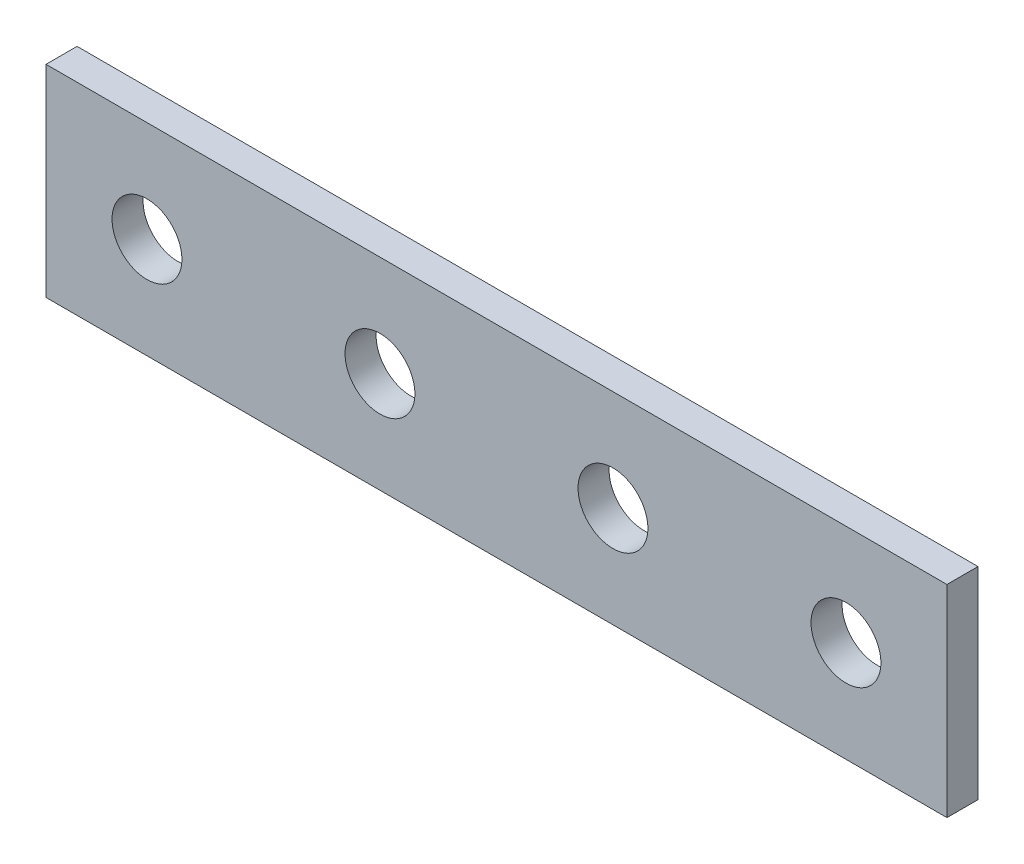
ISO-10303-21;
HEADER;
FILE_DESCRIPTION(('STEP AP214'),'2;1');
FILE_NAME('part.step','',(''),(''),'','','');
FILE_SCHEMA(('AUTOMOTIVE_DESIGN { 1 0 10303 214 1 1 1 1 }'));
ENDSEC;
DATA;
#1=APPLICATION_CONTEXT('core data for automotive mechanical design processes');
#2=APPLICATION_PROTOCOL_DEFINITION('international standard','automotive_design',2000,#1);
#3=PRODUCT_CONTEXT('',#1,'mechanical');
#4=PRODUCT('Part','Part','',(#3));
#5=PRODUCT_RELATED_PRODUCT_CATEGORY('part','',(#4));
#6=PRODUCT_DEFINITION_FORMATION('','',#4);
#7=PRODUCT_DEFINITION_CONTEXT('part definition',#1,'design');
#8=PRODUCT_DEFINITION('design','',#6,#7);
#9=PRODUCT_DEFINITION_SHAPE('','',#8);
#10=(LENGTH_UNIT() NAMED_UNIT(*) SI_UNIT(.MILLI.,.METRE.));
#11=(NAMED_UNIT(*) PLANE_ANGLE_UNIT() SI_UNIT($,.RADIAN.));
#12=(NAMED_UNIT(*) SI_UNIT($,.STERADIAN.) SOLID_ANGLE_UNIT());
#13=UNCERTAINTY_MEASURE_WITH_UNIT(LENGTH_MEASURE(1.E-05),#10,'distance_accuracy_value','');
#14=(GEOMETRIC_REPRESENTATION_CONTEXT(3) GLOBAL_UNCERTAINTY_ASSIGNED_CONTEXT((#13)) GLOBAL_UNIT_ASSIGNED_CONTEXT((#10,
#11,#12)) REPRESENTATION_CONTEXT('',''));
#15=CARTESIAN_POINT('',(0.,0.,0.));
#16=DIRECTION('',(0.,0.,1.));
#17=DIRECTION('',(1.,0.,0.));
#18=AXIS2_PLACEMENT_3D('',#15,#16,#17);
#19=CARTESIAN_POINT('',(-92.075,-20.6375,3.175));
#20=DIRECTION('',(0.,0.,1.));
#21=DIRECTION('',(1.,0.,0.));
#22=AXIS2_PLACEMENT_3D('',#19,#20,#21);
#23=PLANE('',#22);
#24=CARTESIAN_POINT('',(23.8125,0.,3.175));
#25=DIRECTION('',(0.,0.,1.));
#26=DIRECTION('',(1.,0.,0.));
#27=AXIS2_PLACEMENT_3D('',#24,#25,#26);
#28=CIRCLE('',#27,7.14375);
#29=CARTESIAN_POINT('',(30.95625,0.,3.175));
#30=VERTEX_POINT('',#29);
#31=EDGE_CURVE('E144',#30,#30,#28,.T.);
#32=ORIENTED_EDGE('',*,*,#31,.F.);
#33=EDGE_LOOP('',(#32));
#34=FACE_BOUND('',#33,.T.);
#35=CARTESIAN_POINT('',(-71.4375,0.,3.175));
#36=DIRECTION('',(0.,0.,1.));
#37=DIRECTION('',(1.,0.,0.));
#38=AXIS2_PLACEMENT_3D('',#35,#36,#37);
#39=CIRCLE('',#38,7.14375);
#40=CARTESIAN_POINT('',(-64.29375,0.,3.175));
#41=VERTEX_POINT('',#40);
#42=EDGE_CURVE('E114',#41,#41,#39,.T.);
#43=ORIENTED_EDGE('',*,*,#42,.F.);
#44=EDGE_LOOP('',(#43));
#45=FACE_BOUND('',#44,.T.);
#46=DIRECTION('',(0.,-1.,0.));
#47=VECTOR('',#46,1.);
#48=CARTESIAN_POINT('',(-92.075,20.6375,3.175));
#49=LINE('',#48,#47);
#50=CARTESIAN_POINT('',(-92.075,20.6375,3.175));
#51=VERTEX_POINT('',#50);
#52=CARTESIAN_POINT('',(-92.075,-20.6375,3.175));
#53=VERTEX_POINT('',#52);
#54=EDGE_CURVE('E94',#51,#53,#49,.T.);
#55=ORIENTED_EDGE('',*,*,#54,.T.);
#56=DIRECTION('',(1.,0.,0.));
#57=VECTOR('',#56,1.);
#58=CARTESIAN_POINT('',(-92.075,-20.6375,3.175));
#59=LINE('',#58,#57);
#60=CARTESIAN_POINT('',(92.075,-20.6375,3.175));
#61=VERTEX_POINT('',#60);
#62=EDGE_CURVE('E89',#53,#61,#59,.T.);
#63=ORIENTED_EDGE('',*,*,#62,.T.);
#64=DIRECTION('',(0.,1.,0.));
#65=VECTOR('',#64,1.);
#66=CARTESIAN_POINT('',(92.075,20.6375,3.175));
#67=LINE('',#66,#65);
#68=CARTESIAN_POINT('',(92.075,20.6375,3.175));
#69=VERTEX_POINT('',#68);
#70=EDGE_CURVE('E92',#61,#69,#67,.T.);
#71=ORIENTED_EDGE('',*,*,#70,.T.);
#72=DIRECTION('',(-1.,0.,0.));
#73=VECTOR('',#72,1.);
#74=CARTESIAN_POINT('',(-92.075,20.6375,3.175));
#75=LINE('',#74,#73);
#76=EDGE_CURVE('E59',#69,#51,#75,.T.);
#77=ORIENTED_EDGE('',*,*,#76,.T.);
#78=EDGE_LOOP('',(#55,#63,#71,#77));
#79=FACE_BOUND('',#78,.T.);
#80=CARTESIAN_POINT('',(-23.8125,0.,3.175));
#81=DIRECTION('',(0.,0.,1.));
#82=DIRECTION('',(1.,0.,0.));
#83=AXIS2_PLACEMENT_3D('',#80,#81,#82);
#84=CIRCLE('',#83,7.14375);
#85=CARTESIAN_POINT('',(-16.66875,0.,3.175));
#86=VERTEX_POINT('',#85);
#87=EDGE_CURVE('E136',#86,#86,#84,.T.);
#88=ORIENTED_EDGE('',*,*,#87,.F.);
#89=EDGE_LOOP('',(#88));
#90=FACE_BOUND('',#89,.T.);
#91=CARTESIAN_POINT('',(71.4375,0.,3.175));
#92=DIRECTION('',(0.,0.,1.));
#93=DIRECTION('',(1.,0.,0.));
#94=AXIS2_PLACEMENT_3D('',#91,#92,#93);
#95=CIRCLE('',#94,7.14374999999999);
#96=CARTESIAN_POINT('',(78.58125,0.,3.175));
#97=VERTEX_POINT('',#96);
#98=EDGE_CURVE('E152',#97,#97,#95,.T.);
#99=ORIENTED_EDGE('',*,*,#98,.F.);
#100=EDGE_LOOP('',(#99));
#101=FACE_BOUND('',#100,.T.);
#102=ADVANCED_FACE('F41',(#34,#45,#79,#90,#101),#23,.T.);
#103=CARTESIAN_POINT('',(-92.075,-20.6375,-3.175));
#104=DIRECTION('',(0.,0.,1.));
#105=DIRECTION('',(1.,0.,0.));
#106=AXIS2_PLACEMENT_3D('',#103,#104,#105);
#107=PLANE('',#106);
#108=DIRECTION('',(0.,-1.,0.));
#109=VECTOR('',#108,1.);
#110=CARTESIAN_POINT('',(-92.075,20.6375,-3.175));
#111=LINE('',#110,#109);
#112=CARTESIAN_POINT('',(-92.075,20.6375,-3.175));
#113=VERTEX_POINT('',#112);
#114=CARTESIAN_POINT('',(-92.075,-20.6375,-3.175));
#115=VERTEX_POINT('',#114);
#116=EDGE_CURVE('E110',#113,#115,#111,.T.);
#117=ORIENTED_EDGE('',*,*,#116,.F.);
#118=DIRECTION('',(-1.,0.,0.));
#119=VECTOR('',#118,1.);
#120=CARTESIAN_POINT('',(-92.075,20.6375,-3.175));
#121=LINE('',#120,#119);
#122=CARTESIAN_POINT('',(92.075,20.6375,-3.175));
#123=VERTEX_POINT('',#122);
#124=EDGE_CURVE('E82',#123,#113,#121,.T.);
#125=ORIENTED_EDGE('',*,*,#124,.F.);
#126=DIRECTION('',(0.,1.,0.));
#127=VECTOR('',#126,1.);
#128=CARTESIAN_POINT('',(92.075,20.6375,-3.175));
#129=LINE('',#128,#127);
#130=CARTESIAN_POINT('',(92.075,-20.6375,-3.175));
#131=VERTEX_POINT('',#130);
#132=EDGE_CURVE('E76',#131,#123,#129,.T.);
#133=ORIENTED_EDGE('',*,*,#132,.F.);
#134=DIRECTION('',(1.,0.,0.));
#135=VECTOR('',#134,1.);
#136=CARTESIAN_POINT('',(-92.075,-20.6375,-3.175));
#137=LINE('',#136,#135);
#138=EDGE_CURVE('E99',#115,#131,#137,.T.);
#139=ORIENTED_EDGE('',*,*,#138,.F.);
#140=EDGE_LOOP('',(#117,#125,#133,#139));
#141=FACE_BOUND('',#140,.T.);
#142=CARTESIAN_POINT('',(-71.4375,0.,-3.175));
#143=DIRECTION('',(0.,0.,1.));
#144=DIRECTION('',(1.,0.,0.));
#145=AXIS2_PLACEMENT_3D('',#142,#143,#144);
#146=CIRCLE('',#145,7.14375);
#147=CARTESIAN_POINT('',(-64.29375,0.,-3.175));
#148=VERTEX_POINT('',#147);
#149=EDGE_CURVE('E132',#148,#148,#146,.T.);
#150=ORIENTED_EDGE('',*,*,#149,.T.);
#151=EDGE_LOOP('',(#150));
#152=FACE_BOUND('',#151,.T.);
#153=CARTESIAN_POINT('',(-23.8125,0.,-3.175));
#154=DIRECTION('',(0.,0.,1.));
#155=DIRECTION('',(1.,0.,0.));
#156=AXIS2_PLACEMENT_3D('',#153,#154,#155);
#157=CIRCLE('',#156,7.14375);
#158=CARTESIAN_POINT('',(-16.66875,0.,-3.175));
#159=VERTEX_POINT('',#158);
#160=EDGE_CURVE('E140',#159,#159,#157,.T.);
#161=ORIENTED_EDGE('',*,*,#160,.T.);
#162=EDGE_LOOP('',(#161));
#163=FACE_BOUND('',#162,.T.);
#164=CARTESIAN_POINT('',(23.8125,0.,-3.175));
#165=DIRECTION('',(0.,0.,1.));
#166=DIRECTION('',(1.,0.,0.));
#167=AXIS2_PLACEMENT_3D('',#164,#165,#166);
#168=CIRCLE('',#167,7.14375);
#169=CARTESIAN_POINT('',(30.95625,0.,-3.175));
#170=VERTEX_POINT('',#169);
#171=EDGE_CURVE('E148',#170,#170,#168,.T.);
#172=ORIENTED_EDGE('',*,*,#171,.T.);
#173=EDGE_LOOP('',(#172));
#174=FACE_BOUND('',#173,.T.);
#175=CARTESIAN_POINT('',(71.4375,0.,-3.175));
#176=DIRECTION('',(0.,0.,1.));
#177=DIRECTION('',(1.,0.,0.));
#178=AXIS2_PLACEMENT_3D('',#175,#176,#177);
#179=CIRCLE('',#178,7.14374999999999);
#180=CARTESIAN_POINT('',(78.58125,0.,-3.175));
#181=VERTEX_POINT('',#180);
#182=EDGE_CURVE('E156',#181,#181,#179,.T.);
#183=ORIENTED_EDGE('',*,*,#182,.T.);
#184=EDGE_LOOP('',(#183));
#185=FACE_BOUND('',#184,.T.);
#186=ADVANCED_FACE('F127',(#141,#152,#163,#174,#185),#107,.F.);
#187=CARTESIAN_POINT('',(-92.075,20.6375,3.175));
#188=DIRECTION('',(1.,0.,0.));
#189=DIRECTION('',(0.,0.,-1.));
#190=AXIS2_PLACEMENT_3D('',#187,#188,#189);
#191=PLANE('',#190);
#192=ORIENTED_EDGE('',*,*,#116,.T.);
#193=DIRECTION('',(0.,0.,-1.));
#194=VECTOR('',#193,1.);
#195=CARTESIAN_POINT('',(-92.075,-20.6375,3.175));
#196=LINE('',#195,#194);
#197=EDGE_CURVE('E11',#53,#115,#196,.T.);
#198=ORIENTED_EDGE('',*,*,#197,.F.);
#199=ORIENTED_EDGE('',*,*,#54,.F.);
#200=DIRECTION('',(0.,0.,-1.));
#201=VECTOR('',#200,1.);
#202=CARTESIAN_POINT('',(-92.075,20.6375,3.175));
#203=LINE('',#202,#201);
#204=EDGE_CURVE('E106',#51,#113,#203,.T.);
#205=ORIENTED_EDGE('',*,*,#204,.T.);
#206=EDGE_LOOP('',(#192,#198,#199,#205));
#207=FACE_BOUND('',#206,.T.);
#208=ADVANCED_FACE('F43',(#207),#191,.F.);
#209=CARTESIAN_POINT('',(-92.075,-20.6375,3.175));
#210=DIRECTION('',(0.,1.,0.));
#211=DIRECTION('',(0.,0.,1.));
#212=AXIS2_PLACEMENT_3D('',#209,#210,#211);
#213=PLANE('',#212);
#214=ORIENTED_EDGE('',*,*,#138,.T.);
#215=DIRECTION('',(0.,0.,-1.));
#216=VECTOR('',#215,1.);
#217=CARTESIAN_POINT('',(92.075,-20.6375,3.175));
#218=LINE('',#217,#216);
#219=EDGE_CURVE('E51',#61,#131,#218,.T.);
#220=ORIENTED_EDGE('',*,*,#219,.F.);
#221=ORIENTED_EDGE('',*,*,#62,.F.);
#222=ORIENTED_EDGE('',*,*,#197,.T.);
#223=EDGE_LOOP('',(#214,#220,#221,#222));
#224=FACE_BOUND('',#223,.T.);
#225=ADVANCED_FACE('F98',(#224),#213,.F.);
#226=CARTESIAN_POINT('',(92.075,20.6375,3.175));
#227=DIRECTION('',(-1.,0.,0.));
#228=DIRECTION('',(0.,0.,1.));
#229=AXIS2_PLACEMENT_3D('',#226,#227,#228);
#230=PLANE('',#229);
#231=ORIENTED_EDGE('',*,*,#132,.T.);
#232=DIRECTION('',(0.,0.,-1.));
#233=VECTOR('',#232,1.);
#234=CARTESIAN_POINT('',(92.075,20.6375,3.175));
#235=LINE('',#234,#233);
#236=EDGE_CURVE('E101',#69,#123,#235,.T.);
#237=ORIENTED_EDGE('',*,*,#236,.F.);
#238=ORIENTED_EDGE('',*,*,#70,.F.);
#239=ORIENTED_EDGE('',*,*,#219,.T.);
#240=EDGE_LOOP('',(#231,#237,#238,#239));
#241=FACE_BOUND('',#240,.T.);
#242=ADVANCED_FACE('F102',(#241),#230,.F.);
#243=CARTESIAN_POINT('',(-92.075,20.6375,3.175));
#244=DIRECTION('',(0.,-1.,0.));
#245=DIRECTION('',(0.,0.,-1.));
#246=AXIS2_PLACEMENT_3D('',#243,#244,#245);
#247=PLANE('',#246);
#248=ORIENTED_EDGE('',*,*,#124,.T.);
#249=ORIENTED_EDGE('',*,*,#204,.F.);
#250=ORIENTED_EDGE('',*,*,#76,.F.);
#251=ORIENTED_EDGE('',*,*,#236,.T.);
#252=EDGE_LOOP('',(#248,#249,#250,#251));
#253=FACE_BOUND('',#252,.T.);
#254=ADVANCED_FACE('F124',(#253),#247,.F.);
#255=CARTESIAN_POINT('',(-71.4375,0.,3.175));
#256=DIRECTION('',(0.,0.,-1.));
#257=DIRECTION('',(-1.,0.,0.));
#258=AXIS2_PLACEMENT_3D('',#255,#256,#257);
#259=CYLINDRICAL_SURFACE('',#258,7.14375);
#260=ORIENTED_EDGE('',*,*,#42,.T.);
#261=EDGE_LOOP('',(#260));
#262=FACE_BOUND('',#261,.T.);
#263=ORIENTED_EDGE('',*,*,#149,.F.);
#264=EDGE_LOOP('',(#263));
#265=FACE_BOUND('',#264,.T.);
#266=ADVANCED_FACE('F177',(#262,#265),#259,.F.);
#267=CARTESIAN_POINT('',(-23.8125,0.,3.175));
#268=DIRECTION('',(0.,0.,-1.));
#269=DIRECTION('',(-1.,0.,0.));
#270=AXIS2_PLACEMENT_3D('',#267,#268,#269);
#271=CYLINDRICAL_SURFACE('',#270,7.14375);
#272=ORIENTED_EDGE('',*,*,#87,.T.);
#273=EDGE_LOOP('',(#272));
#274=FACE_BOUND('',#273,.T.);
#275=ORIENTED_EDGE('',*,*,#160,.F.);
#276=EDGE_LOOP('',(#275));
#277=FACE_BOUND('',#276,.T.);
#278=ADVANCED_FACE('F223',(#274,#277),#271,.F.);
#279=CARTESIAN_POINT('',(23.8125,0.,3.175));
#280=DIRECTION('',(0.,0.,-1.));
#281=DIRECTION('',(-1.,0.,0.));
#282=AXIS2_PLACEMENT_3D('',#279,#280,#281);
#283=CYLINDRICAL_SURFACE('',#282,7.14375);
#284=ORIENTED_EDGE('',*,*,#31,.T.);
#285=EDGE_LOOP('',(#284));
#286=FACE_BOUND('',#285,.T.);
#287=ORIENTED_EDGE('',*,*,#171,.F.);
#288=EDGE_LOOP('',(#287));
#289=FACE_BOUND('',#288,.T.);
#290=ADVANCED_FACE('F231',(#286,#289),#283,.F.);
#291=CARTESIAN_POINT('',(71.4375,0.,3.175));
#292=DIRECTION('',(0.,0.,-1.));
#293=DIRECTION('',(-1.,0.,0.));
#294=AXIS2_PLACEMENT_3D('',#291,#292,#293);
#295=CYLINDRICAL_SURFACE('',#294,7.14374999999999);
#296=ORIENTED_EDGE('',*,*,#98,.T.);
#297=EDGE_LOOP('',(#296));
#298=FACE_BOUND('',#297,.T.);
#299=ORIENTED_EDGE('',*,*,#182,.F.);
#300=EDGE_LOOP('',(#299));
#301=FACE_BOUND('',#300,.T.);
#302=ADVANCED_FACE('F164',(#298,#301),#295,.F.);
#303=CLOSED_SHELL('',(#102,#186,#208,#225,#242,#254,#266,#278,#290,#302));
#304=MANIFOLD_SOLID_BREP('B2',#303);
#305=ADVANCED_BREP_SHAPE_REPRESENTATION('',(#18,#304),#14);
#306=SHAPE_DEFINITION_REPRESENTATION(#9,#305);
ENDSEC;
END-ISO-10303-21;
